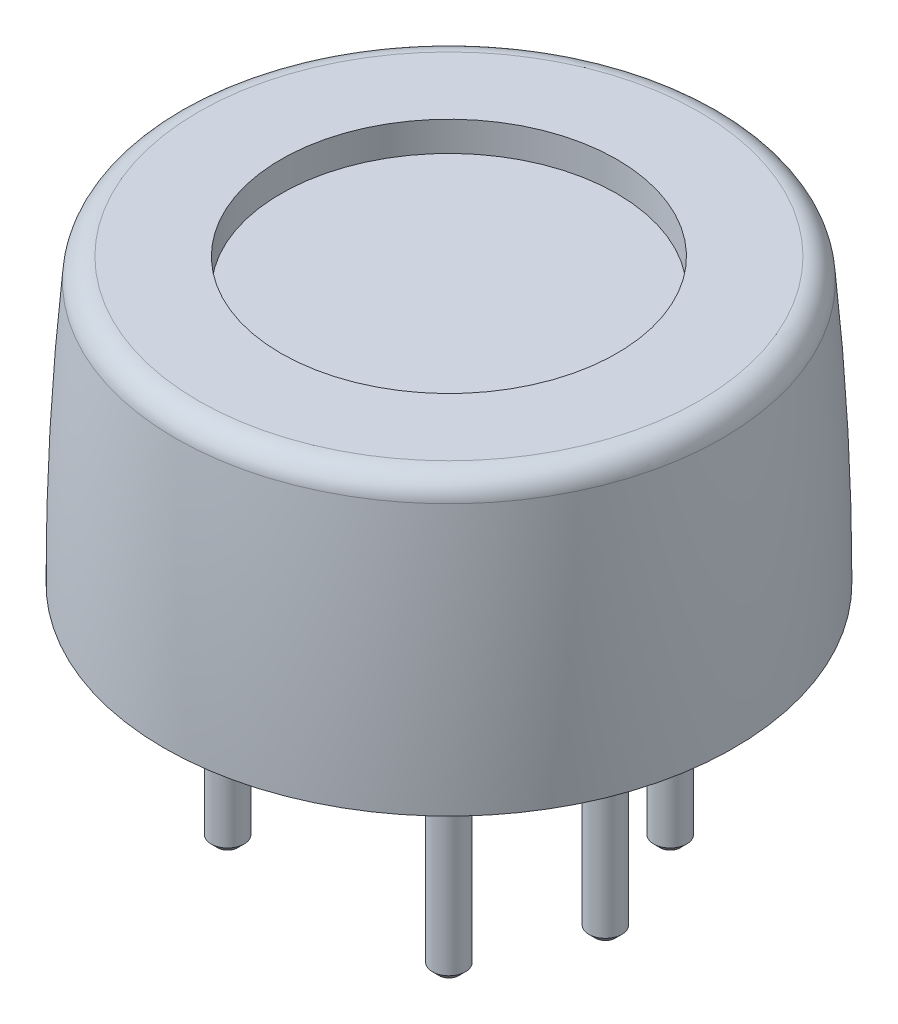
ISO-10303-21;
HEADER;
FILE_DESCRIPTION(('STEP AP214'),'2;1');
FILE_NAME('part.step','',(''),(''),'','','');
FILE_SCHEMA(('AUTOMOTIVE_DESIGN { 1 0 10303 214 1 1 1 1 }'));
ENDSEC;
DATA;
#1=APPLICATION_CONTEXT('core data for automotive mechanical design processes');
#2=APPLICATION_PROTOCOL_DEFINITION('international standard','automotive_design',2000,#1);
#3=PRODUCT_CONTEXT('',#1,'mechanical');
#4=PRODUCT('Part','Part','',(#3));
#5=PRODUCT_RELATED_PRODUCT_CATEGORY('part','',(#4));
#6=PRODUCT_DEFINITION_FORMATION('','',#4);
#7=PRODUCT_DEFINITION_CONTEXT('part definition',#1,'design');
#8=PRODUCT_DEFINITION('design','',#6,#7);
#9=PRODUCT_DEFINITION_SHAPE('','',#8);
#10=(LENGTH_UNIT() NAMED_UNIT(*) SI_UNIT(.MILLI.,.METRE.));
#11=(NAMED_UNIT(*) PLANE_ANGLE_UNIT() SI_UNIT($,.RADIAN.));
#12=(NAMED_UNIT(*) SI_UNIT($,.STERADIAN.) SOLID_ANGLE_UNIT());
#13=UNCERTAINTY_MEASURE_WITH_UNIT(LENGTH_MEASURE(1.E-05),#10,'distance_accuracy_value','');
#14=(GEOMETRIC_REPRESENTATION_CONTEXT(3) GLOBAL_UNCERTAINTY_ASSIGNED_CONTEXT((#13)) GLOBAL_UNIT_ASSIGNED_CONTEXT((#10,
#11,#12)) REPRESENTATION_CONTEXT('',''));
#15=CARTESIAN_POINT('',(0.,0.,0.));
#16=DIRECTION('',(0.,0.,1.));
#17=DIRECTION('',(1.,0.,0.));
#18=AXIS2_PLACEMENT_3D('',#15,#16,#17);
#19=CARTESIAN_POINT('',(0.,1.2,0.));
#20=DIRECTION('',(0.,-1.,0.));
#21=DIRECTION('',(0.,0.,-1.));
#22=AXIS2_PLACEMENT_3D('',#19,#20,#21);
#23=PLANE('',#22);
#24=CARTESIAN_POINT('',(-3.37643488016578,1.2,-3.37643488016575));
#25=DIRECTION('',(0.,-1.,0.));
#26=DIRECTION('',(0.,0.,-1.));
#27=AXIS2_PLACEMENT_3D('',#24,#25,#26);
#28=CIRCLE('',#27,1.425);
#29=CARTESIAN_POINT('',(-4.38406204335661,1.2,-4.38406204335657));
#30=VERTEX_POINT('',#29);
#31=CARTESIAN_POINT('',(-2.36880771697494,1.2,-2.36880771697492));
#32=VERTEX_POINT('',#31);
#33=EDGE_CURVE('E180',#30,#32,#28,.T.);
#34=ORIENTED_EDGE('',*,*,#33,.F.);
#35=CARTESIAN_POINT('',(0.,1.2,0.));
#36=DIRECTION('',(0.,-1.,0.));
#37=DIRECTION('',(0.,0.,-1.));
#38=AXIS2_PLACEMENT_3D('',#35,#36,#37);
#39=CIRCLE('',#38,6.2);
#40=CARTESIAN_POINT('',(-4.38406204335657,1.2,4.38406204335662));
#41=VERTEX_POINT('',#40);
#42=EDGE_CURVE('E116',#41,#30,#39,.T.);
#43=ORIENTED_EDGE('',*,*,#42,.F.);
#44=CARTESIAN_POINT('',(-3.37643488016575,1.2,3.37643488016578));
#45=DIRECTION('',(0.,-1.,0.));
#46=DIRECTION('',(0.,0.,-1.));
#47=AXIS2_PLACEMENT_3D('',#44,#45,#46);
#48=CIRCLE('',#47,1.425);
#49=CARTESIAN_POINT('',(-2.36880771697492,1.2,2.36880771697494));
#50=VERTEX_POINT('',#49);
#51=EDGE_CURVE('E165',#41,#50,#48,.F.);
#52=ORIENTED_EDGE('',*,*,#51,.T.);
#53=CARTESIAN_POINT('',(0.,1.2,0.));
#54=DIRECTION('',(0.,-1.,0.));
#55=DIRECTION('',(0.,0.,-1.));
#56=AXIS2_PLACEMENT_3D('',#53,#54,#55);
#57=CIRCLE('',#56,3.35);
#58=EDGE_CURVE('E184',#50,#32,#57,.T.);
#59=ORIENTED_EDGE('',*,*,#58,.T.);
#60=EDGE_LOOP('',(#34,#43,#52,#59));
#61=FACE_BOUND('',#60,.T.);
#62=CARTESIAN_POINT('',(0.,1.2,0.));
#63=DIRECTION('',(0.,1.,0.));
#64=DIRECTION('',(0.,0.,1.));
#65=AXIS2_PLACEMENT_3D('',#62,#63,#64);
#66=CIRCLE('',#65,7.05);
#67=CARTESIAN_POINT('',(0.,1.2,7.05));
#68=VERTEX_POINT('',#67);
#69=EDGE_CURVE('E231',#68,#68,#66,.T.);
#70=ORIENTED_EDGE('',*,*,#69,.F.);
#71=EDGE_LOOP('',(#70));
#72=FACE_BOUND('',#71,.T.);
#73=CARTESIAN_POINT('',(3.37643488016575,1.2,-3.37643488016578));
#74=DIRECTION('',(0.,-1.,0.));
#75=DIRECTION('',(0.,0.,-1.));
#76=AXIS2_PLACEMENT_3D('',#73,#74,#75);
#77=CIRCLE('',#76,1.425);
#78=CARTESIAN_POINT('',(4.38406204335658,1.2,-4.38406204335661));
#79=VERTEX_POINT('',#78);
#80=CARTESIAN_POINT('',(2.36880771697493,1.2,-2.36880771697494));
#81=VERTEX_POINT('',#80);
#82=EDGE_CURVE('E113',#79,#81,#77,.F.);
#83=ORIENTED_EDGE('',*,*,#82,.T.);
#84=CARTESIAN_POINT('',(0.,1.2,0.));
#85=DIRECTION('',(0.,-1.,0.));
#86=DIRECTION('',(0.,0.,-1.));
#87=AXIS2_PLACEMENT_3D('',#84,#85,#86);
#88=CIRCLE('',#87,3.35);
#89=CARTESIAN_POINT('',(2.36880771697494,1.2,2.36880771697492));
#90=VERTEX_POINT('',#89);
#91=EDGE_CURVE('E132',#81,#90,#88,.T.);
#92=ORIENTED_EDGE('',*,*,#91,.T.);
#93=CARTESIAN_POINT('',(3.37643488016578,1.2,3.37643488016575));
#94=DIRECTION('',(0.,-1.,0.));
#95=DIRECTION('',(0.,0.,-1.));
#96=AXIS2_PLACEMENT_3D('',#93,#94,#95);
#97=CIRCLE('',#96,1.425);
#98=CARTESIAN_POINT('',(4.38406204335661,1.2,4.38406204335658));
#99=VERTEX_POINT('',#98);
#100=EDGE_CURVE('E63',#99,#90,#97,.T.);
#101=ORIENTED_EDGE('',*,*,#100,.F.);
#102=CARTESIAN_POINT('',(0.,1.2,0.));
#103=DIRECTION('',(0.,-1.,0.));
#104=DIRECTION('',(0.,0.,-1.));
#105=AXIS2_PLACEMENT_3D('',#102,#103,#104);
#106=CIRCLE('',#105,6.2);
#107=EDGE_CURVE('E58',#79,#99,#106,.T.);
#108=ORIENTED_EDGE('',*,*,#107,.F.);
#109=EDGE_LOOP('',(#83,#92,#101,#108));
#110=FACE_BOUND('',#109,.T.);
#111=ADVANCED_FACE('F42',(#61,#72,#110),#23,.T.);
#112=CARTESIAN_POINT('',(0.,1.40000000000001,0.));
#113=DIRECTION('',(0.,1.,0.));
#114=DIRECTION('',(0.,0.,1.));
#115=AXIS2_PLACEMENT_3D('',#112,#113,#114);
#116=CONICAL_SURFACE('',#115,7.25,0.785398163397444);
#117=ORIENTED_EDGE('',*,*,#69,.T.);
#118=EDGE_LOOP('',(#117));
#119=FACE_BOUND('',#118,.T.);
#120=CARTESIAN_POINT('',(0.,1.40000000000001,0.));
#121=DIRECTION('',(0.,1.,0.));
#122=DIRECTION('',(0.,0.,1.));
#123=AXIS2_PLACEMENT_3D('',#120,#121,#122);
#124=CIRCLE('',#123,7.25);
#125=CARTESIAN_POINT('',(0.,1.4,7.25));
#126=VERTEX_POINT('',#125);
#127=EDGE_CURVE('E227',#126,#126,#124,.T.);
#128=ORIENTED_EDGE('',*,*,#127,.F.);
#129=EDGE_LOOP('',(#128));
#130=FACE_BOUND('',#129,.T.);
#131=ADVANCED_FACE('F290',(#119,#130),#116,.T.);
#132=CARTESIAN_POINT('',(0.,1.,0.));
#133=DIRECTION('',(0.,-1.,0.));
#134=DIRECTION('',(0.,0.,-1.));
#135=AXIS2_PLACEMENT_3D('',#132,#133,#134);
#136=CONICAL_SURFACE('',#135,7.65,0.785398163397442);
#137=ORIENTED_EDGE('',*,*,#127,.T.);
#138=EDGE_LOOP('',(#137));
#139=FACE_BOUND('',#138,.T.);
#140=CARTESIAN_POINT('',(0.,1.,0.));
#141=DIRECTION('',(0.,1.,0.));
#142=DIRECTION('',(0.,0.,1.));
#143=AXIS2_PLACEMENT_3D('',#140,#141,#142);
#144=CIRCLE('',#143,7.65);
#145=CARTESIAN_POINT('',(0.,0.999999999999999,7.65));
#146=VERTEX_POINT('',#145);
#147=EDGE_CURVE('E223',#146,#146,#144,.T.);
#148=ORIENTED_EDGE('',*,*,#147,.F.);
#149=EDGE_LOOP('',(#148));
#150=FACE_BOUND('',#149,.T.);
#151=ADVANCED_FACE('F296',(#139,#150),#136,.F.);
#152=CARTESIAN_POINT('',(0.,1.,7.65));
#153=DIRECTION('',(0.,-1.,0.));
#154=DIRECTION('',(0.,0.,-1.));
#155=AXIS2_PLACEMENT_3D('',#152,#153,#154);
#156=PLANE('',#155);
#157=ORIENTED_EDGE('',*,*,#147,.T.);
#158=EDGE_LOOP('',(#157));
#159=FACE_BOUND('',#158,.T.);
#160=CARTESIAN_POINT('',(0.,1.00000000000001,0.));
#161=DIRECTION('',(0.,1.,0.));
#162=DIRECTION('',(0.,0.,1.));
#163=AXIS2_PLACEMENT_3D('',#160,#161,#162);
#164=CIRCLE('',#163,8.65);
#165=CARTESIAN_POINT('',(0.,1.00000000000001,8.65));
#166=VERTEX_POINT('',#165);
#167=EDGE_CURVE('E219',#166,#166,#164,.T.);
#168=ORIENTED_EDGE('',*,*,#167,.F.);
#169=EDGE_LOOP('',(#168));
#170=FACE_BOUND('',#169,.T.);
#171=ADVANCED_FACE('F407',(#159,#170),#156,.T.);
#172=CARTESIAN_POINT('',(0.,1.,0.));
#173=DIRECTION('',(0.,1.,0.));
#174=DIRECTION('',(0.,0.,1.));
#175=AXIS2_PLACEMENT_3D('',#172,#173,#174);
#176=DEGENERATE_TOROIDAL_SURFACE('',#175,81.3821428571431,90.0321428571431,.F.);
#177=ORIENTED_EDGE('',*,*,#167,.T.);
#178=EDGE_LOOP('',(#177));
#179=FACE_BOUND('',#178,.T.);
#180=CARTESIAN_POINT('',(0.,8.96190381001879,0.));
#181=DIRECTION('',(0.,1.,0.));
#182=DIRECTION('',(0.,0.,1.));
#183=AXIS2_PLACEMENT_3D('',#180,#181,#182);
#184=CIRCLE('',#183,8.29725742613842);
#185=CARTESIAN_POINT('',(0.,8.96190381001879,8.29725742613842));
#186=VERTEX_POINT('',#185);
#187=EDGE_CURVE('E215',#186,#186,#184,.T.);
#188=ORIENTED_EDGE('',*,*,#187,.F.);
#189=EDGE_LOOP('',(#188));
#190=FACE_BOUND('',#189,.T.);
#191=ADVANCED_FACE('F403',(#179,#190),#176,.F.);
#192=CARTESIAN_POINT('',(0.,8.9,0.));
#193=DIRECTION('',(0.,1.,0.));
#194=DIRECTION('',(0.,0.,1.));
#195=AXIS2_PLACEMENT_3D('',#192,#193,#194);
#196=TOROIDAL_SURFACE('',#195,7.6,0.700000000000001);
#197=ORIENTED_EDGE('',*,*,#187,.T.);
#198=EDGE_LOOP('',(#197));
#199=FACE_BOUND('',#198,.T.);
#200=CARTESIAN_POINT('',(0.,9.6,0.));
#201=DIRECTION('',(0.,1.,0.));
#202=DIRECTION('',(0.,0.,1.));
#203=AXIS2_PLACEMENT_3D('',#200,#201,#202);
#204=CIRCLE('',#203,7.6);
#205=CARTESIAN_POINT('',(0.,9.6,7.6));
#206=VERTEX_POINT('',#205);
#207=EDGE_CURVE('E211',#206,#206,#204,.T.);
#208=ORIENTED_EDGE('',*,*,#207,.F.);
#209=EDGE_LOOP('',(#208));
#210=FACE_BOUND('',#209,.T.);
#211=ADVANCED_FACE('F399',(#199,#210),#196,.T.);
#212=CARTESIAN_POINT('',(0.,9.6,7.6));
#213=DIRECTION('',(0.,1.,0.));
#214=DIRECTION('',(0.,0.,1.));
#215=AXIS2_PLACEMENT_3D('',#212,#213,#214);
#216=PLANE('',#215);
#217=ORIENTED_EDGE('',*,*,#207,.T.);
#218=EDGE_LOOP('',(#217));
#219=FACE_BOUND('',#218,.T.);
#220=CARTESIAN_POINT('',(0.,9.6,0.));
#221=DIRECTION('',(0.,1.,0.));
#222=DIRECTION('',(0.,0.,1.));
#223=AXIS2_PLACEMENT_3D('',#220,#221,#222);
#224=CIRCLE('',#223,5.1);
#225=CARTESIAN_POINT('',(0.,9.6,5.1));
#226=VERTEX_POINT('',#225);
#227=EDGE_CURVE('E208',#226,#226,#224,.T.);
#228=ORIENTED_EDGE('',*,*,#227,.F.);
#229=EDGE_LOOP('',(#228));
#230=FACE_BOUND('',#229,.T.);
#231=ADVANCED_FACE('F395',(#219,#230),#216,.T.);
#232=CARTESIAN_POINT('',(0.,8.7,0.));
#233=DIRECTION('',(0.,1.,0.));
#234=DIRECTION('',(0.,0.,1.));
#235=AXIS2_PLACEMENT_3D('',#232,#233,#234);
#236=CYLINDRICAL_SURFACE('',#235,5.1);
#237=ORIENTED_EDGE('',*,*,#227,.T.);
#238=EDGE_LOOP('',(#237));
#239=FACE_BOUND('',#238,.T.);
#240=CARTESIAN_POINT('',(0.,8.7,0.));
#241=DIRECTION('',(0.,1.,0.));
#242=DIRECTION('',(0.,0.,1.));
#243=AXIS2_PLACEMENT_3D('',#240,#241,#242);
#244=CIRCLE('',#243,5.1);
#245=CARTESIAN_POINT('',(0.,8.7,5.1));
#246=VERTEX_POINT('',#245);
#247=EDGE_CURVE('E204',#246,#246,#244,.T.);
#248=ORIENTED_EDGE('',*,*,#247,.F.);
#249=EDGE_LOOP('',(#248));
#250=FACE_BOUND('',#249,.T.);
#251=ADVANCED_FACE('F391',(#239,#250),#236,.F.);
#252=CARTESIAN_POINT('',(0.,8.7,5.1));
#253=DIRECTION('',(0.,1.,0.));
#254=DIRECTION('',(0.,0.,1.));
#255=AXIS2_PLACEMENT_3D('',#252,#253,#254);
#256=PLANE('',#255);
#257=ORIENTED_EDGE('',*,*,#247,.T.);
#258=EDGE_LOOP('',(#257));
#259=FACE_BOUND('',#258,.T.);
#260=ADVANCED_FACE('F387',(#259),#256,.T.);
#261=CARTESIAN_POINT('',(0.,0.,0.));
#262=DIRECTION('',(0.,1.,0.));
#263=DIRECTION('',(0.,0.,1.));
#264=AXIS2_PLACEMENT_3D('',#261,#262,#263);
#265=CYLINDRICAL_SURFACE('',#264,6.2);
#266=ORIENTED_EDGE('',*,*,#42,.T.);
#267=DIRECTION('',(0.,1.,0.));
#268=VECTOR('',#267,1.);
#269=CARTESIAN_POINT('',(-4.38406204335661,0.,-4.38406204335657));
#270=LINE('',#269,#268);
#271=CARTESIAN_POINT('',(-4.38406204335661,0.,-4.38406204335657));
#272=VERTEX_POINT('',#271);
#273=EDGE_CURVE('E200',#272,#30,#270,.T.);
#274=ORIENTED_EDGE('',*,*,#273,.F.);
#275=CARTESIAN_POINT('',(0.,0.,0.));
#276=DIRECTION('',(0.,-1.,0.));
#277=DIRECTION('',(0.,0.,-1.));
#278=AXIS2_PLACEMENT_3D('',#275,#276,#277);
#279=CIRCLE('',#278,6.2);
#280=CARTESIAN_POINT('',(-4.38406204335657,0.,4.38406204335662));
#281=VERTEX_POINT('',#280);
#282=EDGE_CURVE('E160',#281,#272,#279,.T.);
#283=ORIENTED_EDGE('',*,*,#282,.F.);
#284=DIRECTION('',(0.,1.,0.));
#285=VECTOR('',#284,1.);
#286=CARTESIAN_POINT('',(-4.38406204335657,0.,4.38406204335662));
#287=LINE('',#286,#285);
#288=EDGE_CURVE('E176',#281,#41,#287,.T.);
#289=ORIENTED_EDGE('',*,*,#288,.T.);
#290=EDGE_LOOP('',(#266,#274,#283,#289));
#291=FACE_BOUND('',#290,.T.);
#292=ADVANCED_FACE('F383',(#291),#265,.T.);
#293=CARTESIAN_POINT('',(-3.37643488016578,0.,-3.37643488016575));
#294=DIRECTION('',(0.,1.,0.));
#295=DIRECTION('',(0.,0.,1.));
#296=AXIS2_PLACEMENT_3D('',#293,#294,#295);
#297=CYLINDRICAL_SURFACE('',#296,1.425);
#298=ORIENTED_EDGE('',*,*,#33,.T.);
#299=DIRECTION('',(0.,1.,0.));
#300=VECTOR('',#299,1.);
#301=CARTESIAN_POINT('',(-2.36880771697494,0.,-2.36880771697492));
#302=LINE('',#301,#300);
#303=CARTESIAN_POINT('',(-2.36880771697494,0.,-2.36880771697492));
#304=VERTEX_POINT('',#303);
#305=EDGE_CURVE('E196',#304,#32,#302,.T.);
#306=ORIENTED_EDGE('',*,*,#305,.F.);
#307=CARTESIAN_POINT('',(-3.37643488016578,0.,-3.37643488016575));
#308=DIRECTION('',(0.,-1.,0.));
#309=DIRECTION('',(0.,0.,-1.));
#310=AXIS2_PLACEMENT_3D('',#307,#308,#309);
#311=CIRCLE('',#310,1.425);
#312=EDGE_CURVE('E164',#272,#304,#311,.T.);
#313=ORIENTED_EDGE('',*,*,#312,.F.);
#314=ORIENTED_EDGE('',*,*,#273,.T.);
#315=EDGE_LOOP('',(#298,#306,#313,#314));
#316=FACE_BOUND('',#315,.T.);
#317=ADVANCED_FACE('F379',(#316),#297,.T.);
#318=CARTESIAN_POINT('',(0.,0.,0.));
#319=DIRECTION('',(0.,1.,0.));
#320=DIRECTION('',(0.,0.,1.));
#321=AXIS2_PLACEMENT_3D('',#318,#319,#320);
#322=CYLINDRICAL_SURFACE('',#321,3.35);
#323=ORIENTED_EDGE('',*,*,#58,.F.);
#324=DIRECTION('',(0.,1.,0.));
#325=VECTOR('',#324,1.);
#326=CARTESIAN_POINT('',(-2.36880771697492,0.,2.36880771697495));
#327=LINE('',#326,#325);
#328=CARTESIAN_POINT('',(-2.36880771697492,0.,2.36880771697495));
#329=VERTEX_POINT('',#328);
#330=EDGE_CURVE('E192',#329,#50,#327,.T.);
#331=ORIENTED_EDGE('',*,*,#330,.F.);
#332=CARTESIAN_POINT('',(0.,0.,0.));
#333=DIRECTION('',(0.,-1.,0.));
#334=DIRECTION('',(0.,0.,-1.));
#335=AXIS2_PLACEMENT_3D('',#332,#333,#334);
#336=CIRCLE('',#335,3.35);
#337=EDGE_CURVE('E168',#329,#304,#336,.T.);
#338=ORIENTED_EDGE('',*,*,#337,.T.);
#339=ORIENTED_EDGE('',*,*,#305,.T.);
#340=EDGE_LOOP('',(#323,#331,#338,#339));
#341=FACE_BOUND('',#340,.T.);
#342=ADVANCED_FACE('F375',(#341),#322,.F.);
#343=CARTESIAN_POINT('',(-3.37643488016575,0.,3.37643488016578));
#344=DIRECTION('',(0.,1.,0.));
#345=DIRECTION('',(0.,0.,1.));
#346=AXIS2_PLACEMENT_3D('',#343,#344,#345);
#347=CYLINDRICAL_SURFACE('',#346,1.425);
#348=ORIENTED_EDGE('',*,*,#51,.F.);
#349=ORIENTED_EDGE('',*,*,#288,.F.);
#350=CARTESIAN_POINT('',(-3.37643488016575,0.,3.37643488016578));
#351=DIRECTION('',(0.,-1.,0.));
#352=DIRECTION('',(0.,0.,-1.));
#353=AXIS2_PLACEMENT_3D('',#350,#351,#352);
#354=CIRCLE('',#353,1.425);
#355=EDGE_CURVE('E172',#281,#329,#354,.F.);
#356=ORIENTED_EDGE('',*,*,#355,.T.);
#357=ORIENTED_EDGE('',*,*,#330,.T.);
#358=EDGE_LOOP('',(#348,#349,#356,#357));
#359=FACE_BOUND('',#358,.T.);
#360=ADVANCED_FACE('F371',(#359),#347,.T.);
#361=CARTESIAN_POINT('',(0.,0.,0.));
#362=DIRECTION('',(0.,-1.,0.));
#363=DIRECTION('',(0.,0.,-1.));
#364=AXIS2_PLACEMENT_3D('',#361,#362,#363);
#365=PLANE('',#364);
#366=CARTESIAN_POINT('',(-3.35875721063612,0.,-3.35875721063608));
#367=DIRECTION('',(0.,-1.,0.));
#368=DIRECTION('',(0.,0.,-1.));
#369=AXIS2_PLACEMENT_3D('',#366,#367,#368);
#370=CIRCLE('',#369,0.5);
#371=CARTESIAN_POINT('',(-3.35875721063612,0.,-3.85875721063608));
#372=VERTEX_POINT('',#371);
#373=EDGE_CURVE('E752',#372,#372,#370,.T.);
#374=ORIENTED_EDGE('',*,*,#373,.F.);
#375=EDGE_LOOP('',(#374));
#376=FACE_BOUND('',#375,.T.);
#377=CARTESIAN_POINT('',(-3.35875721063612,0.,3.35875721063608));
#378=DIRECTION('',(0.,-1.,0.));
#379=DIRECTION('',(0.,0.,-1.));
#380=AXIS2_PLACEMENT_3D('',#377,#378,#379);
#381=CIRCLE('',#380,0.5);
#382=CARTESIAN_POINT('',(-3.35875721063612,0.,2.85875721063608));
#383=VERTEX_POINT('',#382);
#384=EDGE_CURVE('E755',#383,#383,#381,.T.);
#385=ORIENTED_EDGE('',*,*,#384,.F.);
#386=EDGE_LOOP('',(#385));
#387=FACE_BOUND('',#386,.T.);
#388=CARTESIAN_POINT('',(-4.75,0.,0.));
#389=DIRECTION('',(0.,-1.,0.));
#390=DIRECTION('',(0.,0.,-1.));
#391=AXIS2_PLACEMENT_3D('',#388,#389,#390);
#392=CIRCLE('',#391,0.5);
#393=CARTESIAN_POINT('',(-4.75,0.,-0.5));
#394=VERTEX_POINT('',#393);
#395=EDGE_CURVE('E138',#394,#394,#392,.T.);
#396=ORIENTED_EDGE('',*,*,#395,.F.);
#397=EDGE_LOOP('',(#396));
#398=FACE_BOUND('',#397,.T.);
#399=ORIENTED_EDGE('',*,*,#282,.T.);
#400=ORIENTED_EDGE('',*,*,#312,.T.);
#401=ORIENTED_EDGE('',*,*,#337,.F.);
#402=ORIENTED_EDGE('',*,*,#355,.F.);
#403=EDGE_LOOP('',(#399,#400,#401,#402));
#404=FACE_BOUND('',#403,.T.);
#405=ADVANCED_FACE('F368',(#376,#387,#398,#404),#365,.T.);
#406=CARTESIAN_POINT('',(3.37643488016575,0.,-3.37643488016578));
#407=DIRECTION('',(0.,1.,0.));
#408=DIRECTION('',(0.,0.,1.));
#409=AXIS2_PLACEMENT_3D('',#406,#407,#408);
#410=CYLINDRICAL_SURFACE('',#409,1.425);
#411=ORIENTED_EDGE('',*,*,#82,.F.);
#412=DIRECTION('',(0.,1.,0.));
#413=VECTOR('',#412,1.);
#414=CARTESIAN_POINT('',(4.38406204335658,0.,-4.38406204335661));
#415=LINE('',#414,#413);
#416=CARTESIAN_POINT('',(4.38406204335658,0.,-4.38406204335661));
#417=VERTEX_POINT('',#416);
#418=EDGE_CURVE('E106',#417,#79,#415,.T.);
#419=ORIENTED_EDGE('',*,*,#418,.F.);
#420=CARTESIAN_POINT('',(3.37643488016575,0.,-3.37643488016578));
#421=DIRECTION('',(0.,-1.,0.));
#422=DIRECTION('',(0.,0.,-1.));
#423=AXIS2_PLACEMENT_3D('',#420,#421,#422);
#424=CIRCLE('',#423,1.425);
#425=CARTESIAN_POINT('',(2.36880771697493,0.,-2.36880771697494));
#426=VERTEX_POINT('',#425);
#427=EDGE_CURVE('E111',#417,#426,#424,.F.);
#428=ORIENTED_EDGE('',*,*,#427,.T.);
#429=DIRECTION('',(0.,1.,0.));
#430=VECTOR('',#429,1.);
#431=CARTESIAN_POINT('',(2.36880771697493,0.,-2.36880771697494));
#432=LINE('',#431,#430);
#433=EDGE_CURVE('E145',#426,#81,#432,.T.);
#434=ORIENTED_EDGE('',*,*,#433,.T.);
#435=EDGE_LOOP('',(#411,#419,#428,#434));
#436=FACE_BOUND('',#435,.T.);
#437=ADVANCED_FACE('F108',(#436),#410,.T.);
#438=CARTESIAN_POINT('',(0.,0.,0.));
#439=DIRECTION('',(0.,1.,0.));
#440=DIRECTION('',(0.,0.,1.));
#441=AXIS2_PLACEMENT_3D('',#438,#439,#440);
#442=CYLINDRICAL_SURFACE('',#441,6.2);
#443=ORIENTED_EDGE('',*,*,#107,.T.);
#444=DIRECTION('',(0.,1.,0.));
#445=VECTOR('',#444,1.);
#446=CARTESIAN_POINT('',(4.38406204335661,0.,4.38406204335658));
#447=LINE('',#446,#445);
#448=CARTESIAN_POINT('',(4.38406204335661,0.,4.38406204335658));
#449=VERTEX_POINT('',#448);
#450=EDGE_CURVE('E117',#449,#99,#447,.T.);
#451=ORIENTED_EDGE('',*,*,#450,.F.);
#452=CARTESIAN_POINT('',(0.,0.,0.));
#453=DIRECTION('',(0.,-1.,0.));
#454=DIRECTION('',(0.,0.,-1.));
#455=AXIS2_PLACEMENT_3D('',#452,#453,#454);
#456=CIRCLE('',#455,6.2);
#457=EDGE_CURVE('E120',#417,#449,#456,.T.);
#458=ORIENTED_EDGE('',*,*,#457,.F.);
#459=ORIENTED_EDGE('',*,*,#418,.T.);
#460=EDGE_LOOP('',(#443,#451,#458,#459));
#461=FACE_BOUND('',#460,.T.);
#462=ADVANCED_FACE('F121',(#461),#442,.T.);
#463=CARTESIAN_POINT('',(3.37643488016578,0.,3.37643488016575));
#464=DIRECTION('',(0.,1.,0.));
#465=DIRECTION('',(0.,0.,1.));
#466=AXIS2_PLACEMENT_3D('',#463,#464,#465);
#467=CYLINDRICAL_SURFACE('',#466,1.425);
#468=ORIENTED_EDGE('',*,*,#100,.T.);
#469=DIRECTION('',(0.,1.,0.));
#470=VECTOR('',#469,1.);
#471=CARTESIAN_POINT('',(2.36880771697494,0.,2.36880771697492));
#472=LINE('',#471,#470);
#473=CARTESIAN_POINT('',(2.36880771697494,0.,2.36880771697492));
#474=VERTEX_POINT('',#473);
#475=EDGE_CURVE('E154',#474,#90,#472,.T.);
#476=ORIENTED_EDGE('',*,*,#475,.F.);
#477=CARTESIAN_POINT('',(3.37643488016578,0.,3.37643488016575));
#478=DIRECTION('',(0.,-1.,0.));
#479=DIRECTION('',(0.,0.,-1.));
#480=AXIS2_PLACEMENT_3D('',#477,#478,#479);
#481=CIRCLE('',#480,1.425);
#482=EDGE_CURVE('E126',#449,#474,#481,.T.);
#483=ORIENTED_EDGE('',*,*,#482,.F.);
#484=ORIENTED_EDGE('',*,*,#450,.T.);
#485=EDGE_LOOP('',(#468,#476,#483,#484));
#486=FACE_BOUND('',#485,.T.);
#487=ADVANCED_FACE('F359',(#486),#467,.T.);
#488=CARTESIAN_POINT('',(0.,0.,0.));
#489=DIRECTION('',(0.,1.,0.));
#490=DIRECTION('',(0.,0.,1.));
#491=AXIS2_PLACEMENT_3D('',#488,#489,#490);
#492=CYLINDRICAL_SURFACE('',#491,3.35);
#493=ORIENTED_EDGE('',*,*,#91,.F.);
#494=ORIENTED_EDGE('',*,*,#433,.F.);
#495=CARTESIAN_POINT('',(0.,0.,0.));
#496=DIRECTION('',(0.,-1.,0.));
#497=DIRECTION('',(0.,0.,-1.));
#498=AXIS2_PLACEMENT_3D('',#495,#496,#497);
#499=CIRCLE('',#498,3.35);
#500=EDGE_CURVE('E130',#426,#474,#499,.T.);
#501=ORIENTED_EDGE('',*,*,#500,.T.);
#502=ORIENTED_EDGE('',*,*,#475,.T.);
#503=EDGE_LOOP('',(#493,#494,#501,#502));
#504=FACE_BOUND('',#503,.T.);
#505=ADVANCED_FACE('F355',(#504),#492,.F.);
#506=CARTESIAN_POINT('',(0.,0.,0.));
#507=DIRECTION('',(0.,-1.,0.));
#508=DIRECTION('',(0.,0.,-1.));
#509=AXIS2_PLACEMENT_3D('',#506,#507,#508);
#510=PLANE('',#509);
#511=CARTESIAN_POINT('',(3.35875721063612,0.,-3.35875721063608));
#512=DIRECTION('',(0.,-1.,0.));
#513=DIRECTION('',(0.,0.,1.));
#514=AXIS2_PLACEMENT_3D('',#511,#512,#513);
#515=CIRCLE('',#514,0.5);
#516=CARTESIAN_POINT('',(3.35875721063612,0.,-2.85875721063608));
#517=VERTEX_POINT('',#516);
#518=EDGE_CURVE('E739',#517,#517,#515,.T.);
#519=ORIENTED_EDGE('',*,*,#518,.F.);
#520=EDGE_LOOP('',(#519));
#521=FACE_BOUND('',#520,.T.);
#522=CARTESIAN_POINT('',(4.75,0.,0.));
#523=DIRECTION('',(0.,-1.,0.));
#524=DIRECTION('',(0.,0.,1.));
#525=AXIS2_PLACEMENT_3D('',#522,#523,#524);
#526=CIRCLE('',#525,0.5);
#527=CARTESIAN_POINT('',(4.75,0.,0.5));
#528=VERTEX_POINT('',#527);
#529=EDGE_CURVE('E741',#528,#528,#526,.T.);
#530=ORIENTED_EDGE('',*,*,#529,.F.);
#531=EDGE_LOOP('',(#530));
#532=FACE_BOUND('',#531,.T.);
#533=CARTESIAN_POINT('',(3.35875721063612,0.,3.35875721063608));
#534=DIRECTION('',(0.,-1.,0.));
#535=DIRECTION('',(0.,0.,1.));
#536=AXIS2_PLACEMENT_3D('',#533,#534,#535);
#537=CIRCLE('',#536,0.5);
#538=CARTESIAN_POINT('',(3.35875721063612,0.,3.85875721063608));
#539=VERTEX_POINT('',#538);
#540=EDGE_CURVE('E746',#539,#539,#537,.T.);
#541=ORIENTED_EDGE('',*,*,#540,.F.);
#542=EDGE_LOOP('',(#541));
#543=FACE_BOUND('',#542,.T.);
#544=ORIENTED_EDGE('',*,*,#427,.F.);
#545=ORIENTED_EDGE('',*,*,#457,.T.);
#546=ORIENTED_EDGE('',*,*,#482,.T.);
#547=ORIENTED_EDGE('',*,*,#500,.F.);
#548=EDGE_LOOP('',(#544,#545,#546,#547));
#549=FACE_BOUND('',#548,.T.);
#550=ADVANCED_FACE('F128',(#521,#532,#543,#549),#510,.T.);
#551=CARTESIAN_POINT('',(-4.75,-5.8,0.));
#552=DIRECTION('',(0.,1.,0.));
#553=DIRECTION('',(0.,0.,1.));
#554=AXIS2_PLACEMENT_3D('',#551,#552,#553);
#555=CYLINDRICAL_SURFACE('',#554,0.5);
#556=CARTESIAN_POINT('',(-4.75,-5.6,0.));
#557=DIRECTION('',(0.,-1.,0.));
#558=DIRECTION('',(0.,0.,-1.));
#559=AXIS2_PLACEMENT_3D('',#556,#557,#558);
#560=CIRCLE('',#559,0.5);
#561=CARTESIAN_POINT('',(-4.75,-5.6,-0.5));
#562=VERTEX_POINT('',#561);
#563=EDGE_CURVE('E271',#562,#562,#560,.F.);
#564=ORIENTED_EDGE('',*,*,#563,.T.);
#565=EDGE_LOOP('',(#564));
#566=FACE_BOUND('',#565,.T.);
#567=ORIENTED_EDGE('',*,*,#395,.T.);
#568=EDGE_LOOP('',(#567));
#569=FACE_BOUND('',#568,.T.);
#570=ADVANCED_FACE('F348',(#566,#569),#555,.T.);
#571=CARTESIAN_POINT('',(-4.75,-5.8,0.));
#572=DIRECTION('',(0.,-1.,0.));
#573=DIRECTION('',(0.,0.,-1.));
#574=AXIS2_PLACEMENT_3D('',#571,#572,#573);
#575=PLANE('',#574);
#576=CARTESIAN_POINT('',(-4.75,-5.8,0.));
#577=DIRECTION('',(0.,-1.,0.));
#578=DIRECTION('',(0.,0.,-1.));
#579=AXIS2_PLACEMENT_3D('',#576,#577,#578);
#580=CIRCLE('',#579,0.300000000000002);
#581=CARTESIAN_POINT('',(-4.75,-5.8,-0.300000000000002));
#582=VERTEX_POINT('',#581);
#583=EDGE_CURVE('E267',#582,#582,#580,.T.);
#584=ORIENTED_EDGE('',*,*,#583,.T.);
#585=EDGE_LOOP('',(#584));
#586=FACE_BOUND('',#585,.T.);
#587=ADVANCED_FACE('F344',(#586),#575,.T.);
#588=CARTESIAN_POINT('',(-3.35875721063612,-5.8,3.35875721063608));
#589=DIRECTION('',(0.,1.,0.));
#590=DIRECTION('',(0.,0.,1.));
#591=AXIS2_PLACEMENT_3D('',#588,#589,#590);
#592=CYLINDRICAL_SURFACE('',#591,0.5);
#593=CARTESIAN_POINT('',(-3.35875721063612,-5.59999999999999,3.35875721063608));
#594=DIRECTION('',(0.,-1.,0.));
#595=DIRECTION('',(0.,0.,-1.));
#596=AXIS2_PLACEMENT_3D('',#593,#594,#595);
#597=CIRCLE('',#596,0.5);
#598=CARTESIAN_POINT('',(-3.35875721063612,-5.59999999999999,2.85875721063608));
#599=VERTEX_POINT('',#598);
#600=EDGE_CURVE('E11',#599,#599,#597,.F.);
#601=ORIENTED_EDGE('',*,*,#600,.T.);
#602=EDGE_LOOP('',(#601));
#603=FACE_BOUND('',#602,.T.);
#604=ORIENTED_EDGE('',*,*,#384,.T.);
#605=EDGE_LOOP('',(#604));
#606=FACE_BOUND('',#605,.T.);
#607=ADVANCED_FACE('F341',(#603,#606),#592,.T.);
#608=CARTESIAN_POINT('',(-3.35875721063612,-5.8,3.35875721063608));
#609=DIRECTION('',(0.,-1.,0.));
#610=DIRECTION('',(0.,0.,-1.));
#611=AXIS2_PLACEMENT_3D('',#608,#609,#610);
#612=PLANE('',#611);
#613=CARTESIAN_POINT('',(-3.35875721063612,-5.8,3.35875721063608));
#614=DIRECTION('',(0.,-1.,0.));
#615=DIRECTION('',(0.,0.,-1.));
#616=AXIS2_PLACEMENT_3D('',#613,#614,#615);
#617=CIRCLE('',#616,0.299999999999995);
#618=CARTESIAN_POINT('',(-3.35875721063612,-5.8,3.05875721063609));
#619=VERTEX_POINT('',#618);
#620=EDGE_CURVE('E51',#619,#619,#617,.T.);
#621=ORIENTED_EDGE('',*,*,#620,.T.);
#622=EDGE_LOOP('',(#621));
#623=FACE_BOUND('',#622,.T.);
#624=ADVANCED_FACE('F278',(#623),#612,.T.);
#625=CARTESIAN_POINT('',(-3.35875721063612,-5.8,-3.35875721063608));
#626=DIRECTION('',(0.,1.,0.));
#627=DIRECTION('',(0.,0.,1.));
#628=AXIS2_PLACEMENT_3D('',#625,#626,#627);
#629=CYLINDRICAL_SURFACE('',#628,0.5);
#630=CARTESIAN_POINT('',(-3.35875721063612,-5.59999999999999,-3.35875721063608));
#631=DIRECTION('',(0.,-1.,0.));
#632=DIRECTION('',(0.,0.,-1.));
#633=AXIS2_PLACEMENT_3D('',#630,#631,#632);
#634=CIRCLE('',#633,0.5);
#635=CARTESIAN_POINT('',(-3.35875721063612,-5.59999999999999,-3.85875721063608));
#636=VERTEX_POINT('',#635);
#637=EDGE_CURVE('E263',#636,#636,#634,.F.);
#638=ORIENTED_EDGE('',*,*,#637,.T.);
#639=EDGE_LOOP('',(#638));
#640=FACE_BOUND('',#639,.T.);
#641=ORIENTED_EDGE('',*,*,#373,.T.);
#642=EDGE_LOOP('',(#641));
#643=FACE_BOUND('',#642,.T.);
#644=ADVANCED_FACE('F326',(#640,#643),#629,.T.);
#645=CARTESIAN_POINT('',(-3.35875721063612,-5.8,-3.35875721063608));
#646=DIRECTION('',(0.,-1.,0.));
#647=DIRECTION('',(0.,0.,-1.));
#648=AXIS2_PLACEMENT_3D('',#645,#646,#647);
#649=PLANE('',#648);
#650=CARTESIAN_POINT('',(-3.35875721063612,-5.8,-3.35875721063608));
#651=DIRECTION('',(0.,-1.,0.));
#652=DIRECTION('',(0.,0.,-1.));
#653=AXIS2_PLACEMENT_3D('',#650,#651,#652);
#654=CIRCLE('',#653,0.299999999999995);
#655=CARTESIAN_POINT('',(-3.35875721063612,-5.8,-3.65875721063608));
#656=VERTEX_POINT('',#655);
#657=EDGE_CURVE('E259',#656,#656,#654,.T.);
#658=ORIENTED_EDGE('',*,*,#657,.T.);
#659=EDGE_LOOP('',(#658));
#660=FACE_BOUND('',#659,.T.);
#661=ADVANCED_FACE('F323',(#660),#649,.T.);
#662=CARTESIAN_POINT('',(3.35875721063612,-5.8,3.35875721063608));
#663=DIRECTION('',(0.,1.,0.));
#664=DIRECTION('',(0.,0.,1.));
#665=AXIS2_PLACEMENT_3D('',#662,#663,#664);
#666=CYLINDRICAL_SURFACE('',#665,0.5);
#667=CARTESIAN_POINT('',(3.35875721063612,-5.6,3.35875721063608));
#668=DIRECTION('',(0.,1.,0.));
#669=DIRECTION('',(0.,0.,1.));
#670=AXIS2_PLACEMENT_3D('',#667,#668,#669);
#671=CIRCLE('',#670,0.5);
#672=CARTESIAN_POINT('',(3.35875721063612,-5.6,3.85875721063608));
#673=VERTEX_POINT('',#672);
#674=EDGE_CURVE('E239',#673,#673,#671,.T.);
#675=ORIENTED_EDGE('',*,*,#674,.T.);
#676=EDGE_LOOP('',(#675));
#677=FACE_BOUND('',#676,.T.);
#678=ORIENTED_EDGE('',*,*,#540,.T.);
#679=EDGE_LOOP('',(#678));
#680=FACE_BOUND('',#679,.T.);
#681=ADVANCED_FACE('F325',(#677,#680),#666,.T.);
#682=CARTESIAN_POINT('',(3.35875721063612,-5.8,3.35875721063608));
#683=DIRECTION('',(0.,1.,0.));
#684=DIRECTION('',(0.,0.,1.));
#685=AXIS2_PLACEMENT_3D('',#682,#683,#684);
#686=PLANE('',#685);
#687=CARTESIAN_POINT('',(3.35875721063612,-5.8,3.35875721063608));
#688=DIRECTION('',(0.,1.,0.));
#689=DIRECTION('',(0.,0.,1.));
#690=AXIS2_PLACEMENT_3D('',#687,#688,#689);
#691=CIRCLE('',#690,0.300000000000005);
#692=CARTESIAN_POINT('',(3.35875721063612,-5.8,3.65875721063609));
#693=VERTEX_POINT('',#692);
#694=EDGE_CURVE('E235',#693,#693,#691,.F.);
#695=ORIENTED_EDGE('',*,*,#694,.T.);
#696=EDGE_LOOP('',(#695));
#697=FACE_BOUND('',#696,.T.);
#698=ADVANCED_FACE('F332',(#697),#686,.F.);
#699=CARTESIAN_POINT('',(4.75,-5.8,0.));
#700=DIRECTION('',(0.,1.,0.));
#701=DIRECTION('',(0.,0.,1.));
#702=AXIS2_PLACEMENT_3D('',#699,#700,#701);
#703=CYLINDRICAL_SURFACE('',#702,0.5);
#704=CARTESIAN_POINT('',(4.75,-5.60000000000001,0.));
#705=DIRECTION('',(0.,1.,0.));
#706=DIRECTION('',(0.,0.,1.));
#707=AXIS2_PLACEMENT_3D('',#704,#705,#706);
#708=CIRCLE('',#707,0.5);
#709=CARTESIAN_POINT('',(4.75,-5.60000000000001,0.499999999999999));
#710=VERTEX_POINT('',#709);
#711=EDGE_CURVE('E247',#710,#710,#708,.T.);
#712=ORIENTED_EDGE('',*,*,#711,.T.);
#713=EDGE_LOOP('',(#712));
#714=FACE_BOUND('',#713,.T.);
#715=ORIENTED_EDGE('',*,*,#529,.T.);
#716=EDGE_LOOP('',(#715));
#717=FACE_BOUND('',#716,.T.);
#718=ADVANCED_FACE('F509',(#714,#717),#703,.T.);
#719=CARTESIAN_POINT('',(4.75,-5.8,0.));
#720=DIRECTION('',(0.,1.,0.));
#721=DIRECTION('',(0.,0.,1.));
#722=AXIS2_PLACEMENT_3D('',#719,#720,#721);
#723=PLANE('',#722);
#724=CARTESIAN_POINT('',(4.75,-5.8,0.));
#725=DIRECTION('',(0.,1.,0.));
#726=DIRECTION('',(0.,0.,1.));
#727=AXIS2_PLACEMENT_3D('',#724,#725,#726);
#728=CIRCLE('',#727,0.300000000000009);
#729=CARTESIAN_POINT('',(4.75,-5.8,0.300000000000008));
#730=VERTEX_POINT('',#729);
#731=EDGE_CURVE('E243',#730,#730,#728,.F.);
#732=ORIENTED_EDGE('',*,*,#731,.T.);
#733=EDGE_LOOP('',(#732));
#734=FACE_BOUND('',#733,.T.);
#735=ADVANCED_FACE('F517',(#734),#723,.F.);
#736=CARTESIAN_POINT('',(3.35875721063612,-5.8,-3.35875721063608));
#737=DIRECTION('',(0.,1.,0.));
#738=DIRECTION('',(0.,0.,1.));
#739=AXIS2_PLACEMENT_3D('',#736,#737,#738);
#740=CYLINDRICAL_SURFACE('',#739,0.5);
#741=CARTESIAN_POINT('',(3.35875721063612,-5.6,-3.35875721063608));
#742=DIRECTION('',(0.,1.,0.));
#743=DIRECTION('',(0.,0.,1.));
#744=AXIS2_PLACEMENT_3D('',#741,#742,#743);
#745=CIRCLE('',#744,0.5);
#746=CARTESIAN_POINT('',(3.35875721063612,-5.6,-2.85875721063608));
#747=VERTEX_POINT('',#746);
#748=EDGE_CURVE('E255',#747,#747,#745,.T.);
#749=ORIENTED_EDGE('',*,*,#748,.T.);
#750=EDGE_LOOP('',(#749));
#751=FACE_BOUND('',#750,.T.);
#752=ORIENTED_EDGE('',*,*,#518,.T.);
#753=EDGE_LOOP('',(#752));
#754=FACE_BOUND('',#753,.T.);
#755=ADVANCED_FACE('F526',(#751,#754),#740,.T.);
#756=CARTESIAN_POINT('',(3.35875721063612,-5.8,-3.35875721063608));
#757=DIRECTION('',(0.,1.,0.));
#758=DIRECTION('',(0.,0.,1.));
#759=AXIS2_PLACEMENT_3D('',#756,#757,#758);
#760=PLANE('',#759);
#761=CARTESIAN_POINT('',(3.35875721063612,-5.8,-3.35875721063608));
#762=DIRECTION('',(0.,1.,0.));
#763=DIRECTION('',(0.,0.,1.));
#764=AXIS2_PLACEMENT_3D('',#761,#762,#763);
#765=CIRCLE('',#764,0.299999999999995);
#766=CARTESIAN_POINT('',(3.35875721063612,-5.8,-3.05875721063609));
#767=VERTEX_POINT('',#766);
#768=EDGE_CURVE('E251',#767,#767,#765,.F.);
#769=ORIENTED_EDGE('',*,*,#768,.T.);
#770=EDGE_LOOP('',(#769));
#771=FACE_BOUND('',#770,.T.);
#772=ADVANCED_FACE('F306',(#771),#760,.F.);
#773=CARTESIAN_POINT('',(3.35875721063612,-5.8,3.35875721063608));
#774=DIRECTION('',(0.,1.,0.));
#775=DIRECTION('',(0.,0.,1.));
#776=AXIS2_PLACEMENT_3D('',#773,#774,#775);
#777=CONICAL_SURFACE('',#776,0.300000000000005,0.785398163397442);
#778=ORIENTED_EDGE('',*,*,#674,.F.);
#779=EDGE_LOOP('',(#778));
#780=FACE_BOUND('',#779,.T.);
#781=ORIENTED_EDGE('',*,*,#694,.F.);
#782=EDGE_LOOP('',(#781));
#783=FACE_BOUND('',#782,.T.);
#784=ADVANCED_FACE('F302',(#780,#783),#777,.T.);
#785=CARTESIAN_POINT('',(4.75,-5.8,0.));
#786=DIRECTION('',(0.,1.,0.));
#787=DIRECTION('',(0.,0.,1.));
#788=AXIS2_PLACEMENT_3D('',#785,#786,#787);
#789=CONICAL_SURFACE('',#788,0.300000000000009,0.785398163397442);
#790=ORIENTED_EDGE('',*,*,#711,.F.);
#791=EDGE_LOOP('',(#790));
#792=FACE_BOUND('',#791,.T.);
#793=ORIENTED_EDGE('',*,*,#731,.F.);
#794=EDGE_LOOP('',(#793));
#795=FACE_BOUND('',#794,.T.);
#796=ADVANCED_FACE('F305',(#792,#795),#789,.T.);
#797=CARTESIAN_POINT('',(3.35875721063612,-5.8,-3.35875721063608));
#798=DIRECTION('',(0.,1.,0.));
#799=DIRECTION('',(0.,0.,1.));
#800=AXIS2_PLACEMENT_3D('',#797,#798,#799);
#801=CONICAL_SURFACE('',#800,0.299999999999995,0.78539816339745);
#802=ORIENTED_EDGE('',*,*,#748,.F.);
#803=EDGE_LOOP('',(#802));
#804=FACE_BOUND('',#803,.T.);
#805=ORIENTED_EDGE('',*,*,#768,.F.);
#806=EDGE_LOOP('',(#805));
#807=FACE_BOUND('',#806,.T.);
#808=ADVANCED_FACE('F310',(#804,#807),#801,.T.);
#809=CARTESIAN_POINT('',(-3.35875721063612,-5.8,-3.35875721063608));
#810=DIRECTION('',(0.,1.,0.));
#811=DIRECTION('',(0.,0.,1.));
#812=AXIS2_PLACEMENT_3D('',#809,#810,#811);
#813=CONICAL_SURFACE('',#812,0.299999999999995,0.785398163397443);
#814=ORIENTED_EDGE('',*,*,#637,.F.);
#815=EDGE_LOOP('',(#814));
#816=FACE_BOUND('',#815,.T.);
#817=ORIENTED_EDGE('',*,*,#657,.F.);
#818=EDGE_LOOP('',(#817));
#819=FACE_BOUND('',#818,.T.);
#820=ADVANCED_FACE('F286',(#816,#819),#813,.T.);
#821=CARTESIAN_POINT('',(-4.75,-5.8,0.));
#822=DIRECTION('',(0.,1.,0.));
#823=DIRECTION('',(0.,0.,1.));
#824=AXIS2_PLACEMENT_3D('',#821,#822,#823);
#825=CONICAL_SURFACE('',#824,0.300000000000002,0.785398163397445);
#826=ORIENTED_EDGE('',*,*,#563,.F.);
#827=EDGE_LOOP('',(#826));
#828=FACE_BOUND('',#827,.T.);
#829=ORIENTED_EDGE('',*,*,#583,.F.);
#830=EDGE_LOOP('',(#829));
#831=FACE_BOUND('',#830,.T.);
#832=ADVANCED_FACE('F281',(#828,#831),#825,.T.);
#833=CARTESIAN_POINT('',(-3.35875721063612,-5.8,3.35875721063608));
#834=DIRECTION('',(0.,1.,0.));
#835=DIRECTION('',(0.,0.,1.));
#836=AXIS2_PLACEMENT_3D('',#833,#834,#835);
#837=CONICAL_SURFACE('',#836,0.299999999999995,0.785398163397442);
#838=ORIENTED_EDGE('',*,*,#600,.F.);
#839=EDGE_LOOP('',(#838));
#840=FACE_BOUND('',#839,.T.);
#841=ORIENTED_EDGE('',*,*,#620,.F.);
#842=EDGE_LOOP('',(#841));
#843=FACE_BOUND('',#842,.T.);
#844=ADVANCED_FACE('F44',(#840,#843),#837,.T.);
#845=CLOSED_SHELL('',(#111,#131,#151,#171,#191,#211,#231,#251,#260,#292,#317,#342,#360,#405,
#437,#462,#487,#505,#550,#570,#587,#607,#624,#644,#661,#681,#698,#718,#735,#755,#772,#784,#796,
#808,#820,#832,#844));
#846=MANIFOLD_SOLID_BREP('B2',#845);
#847=ADVANCED_BREP_SHAPE_REPRESENTATION('',(#18,#846),#14);
#848=SHAPE_DEFINITION_REPRESENTATION(#9,#847);
ENDSEC;
END-ISO-10303-21;
